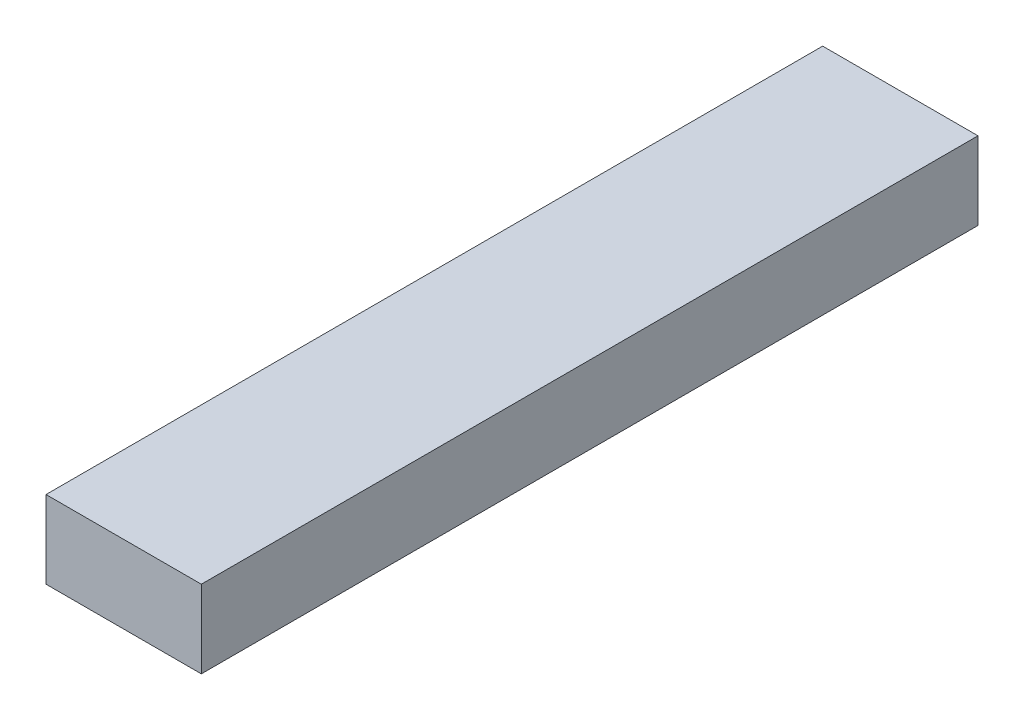
ISO-10303-21;
HEADER;
FILE_DESCRIPTION(('STEP AP214'),'2;1');
FILE_NAME('part.step','',(''),(''),'','','');
FILE_SCHEMA(('AUTOMOTIVE_DESIGN { 1 0 10303 214 1 1 1 1 }'));
ENDSEC;
DATA;
#1=APPLICATION_CONTEXT('core data for automotive mechanical design processes');
#2=APPLICATION_PROTOCOL_DEFINITION('international standard','automotive_design',2000,#1);
#3=PRODUCT_CONTEXT('',#1,'mechanical');
#4=PRODUCT('Part','Part','',(#3));
#5=PRODUCT_RELATED_PRODUCT_CATEGORY('part','',(#4));
#6=PRODUCT_DEFINITION_FORMATION('','',#4);
#7=PRODUCT_DEFINITION_CONTEXT('part definition',#1,'design');
#8=PRODUCT_DEFINITION('design','',#6,#7);
#9=PRODUCT_DEFINITION_SHAPE('','',#8);
#10=(LENGTH_UNIT() NAMED_UNIT(*) SI_UNIT(.MILLI.,.METRE.));
#11=(NAMED_UNIT(*) PLANE_ANGLE_UNIT() SI_UNIT($,.RADIAN.));
#12=(NAMED_UNIT(*) SI_UNIT($,.STERADIAN.) SOLID_ANGLE_UNIT());
#13=UNCERTAINTY_MEASURE_WITH_UNIT(LENGTH_MEASURE(1.E-05),#10,'distance_accuracy_value','');
#14=(GEOMETRIC_REPRESENTATION_CONTEXT(3) GLOBAL_UNCERTAINTY_ASSIGNED_CONTEXT((#13)) GLOBAL_UNIT_ASSIGNED_CONTEXT((#10,
#11,#12)) REPRESENTATION_CONTEXT('',''));
#15=CARTESIAN_POINT('',(0.,0.,0.));
#16=DIRECTION('',(0.,0.,1.));
#17=DIRECTION('',(1.,0.,0.));
#18=AXIS2_PLACEMENT_3D('',#15,#16,#17);
#19=CARTESIAN_POINT('',(0.,0.,200.));
#20=DIRECTION('',(1.,0.,0.));
#21=DIRECTION('',(0.,0.,-1.));
#22=AXIS2_PLACEMENT_3D('',#19,#20,#21);
#23=PLANE('',#22);
#24=DIRECTION('',(0.,-1.,0.));
#25=VECTOR('',#24,1.);
#26=CARTESIAN_POINT('',(0.,0.,0.));
#27=LINE('',#26,#25);
#28=CARTESIAN_POINT('',(0.,20.,0.));
#29=VERTEX_POINT('',#28);
#30=CARTESIAN_POINT('',(0.,0.,0.));
#31=VERTEX_POINT('',#30);
#32=EDGE_CURVE('E96',#29,#31,#27,.T.);
#33=ORIENTED_EDGE('',*,*,#32,.T.);
#34=DIRECTION('',(0.,0.,-1.));
#35=VECTOR('',#34,1.);
#36=CARTESIAN_POINT('',(0.,0.,200.));
#37=LINE('',#36,#35);
#38=CARTESIAN_POINT('',(0.,0.,200.));
#39=VERTEX_POINT('',#38);
#40=EDGE_CURVE('E11',#39,#31,#37,.T.);
#41=ORIENTED_EDGE('',*,*,#40,.F.);
#42=DIRECTION('',(0.,-1.,0.));
#43=VECTOR('',#42,1.);
#44=CARTESIAN_POINT('',(0.,0.,200.));
#45=LINE('',#44,#43);
#46=CARTESIAN_POINT('',(0.,20.,200.));
#47=VERTEX_POINT('',#46);
#48=EDGE_CURVE('E84',#47,#39,#45,.T.);
#49=ORIENTED_EDGE('',*,*,#48,.F.);
#50=DIRECTION('',(0.,0.,-1.));
#51=VECTOR('',#50,1.);
#52=CARTESIAN_POINT('',(0.,20.,200.));
#53=LINE('',#52,#51);
#54=EDGE_CURVE('E92',#47,#29,#53,.T.);
#55=ORIENTED_EDGE('',*,*,#54,.T.);
#56=EDGE_LOOP('',(#33,#41,#49,#55));
#57=FACE_BOUND('',#56,.T.);
#58=ADVANCED_FACE('F33',(#57),#23,.F.);
#59=CARTESIAN_POINT('',(0.,0.,200.));
#60=DIRECTION('',(0.,1.,0.));
#61=DIRECTION('',(0.,0.,1.));
#62=AXIS2_PLACEMENT_3D('',#59,#60,#61);
#63=PLANE('',#62);
#64=DIRECTION('',(1.,0.,0.));
#65=VECTOR('',#64,1.);
#66=CARTESIAN_POINT('',(0.,0.,0.));
#67=LINE('',#66,#65);
#68=CARTESIAN_POINT('',(40.,0.,0.));
#69=VERTEX_POINT('',#68);
#70=EDGE_CURVE('E88',#31,#69,#67,.T.);
#71=ORIENTED_EDGE('',*,*,#70,.T.);
#72=DIRECTION('',(0.,0.,-1.));
#73=VECTOR('',#72,1.);
#74=CARTESIAN_POINT('',(40.,0.,200.));
#75=LINE('',#74,#73);
#76=CARTESIAN_POINT('',(40.,0.,200.));
#77=VERTEX_POINT('',#76);
#78=EDGE_CURVE('E41',#77,#69,#75,.T.);
#79=ORIENTED_EDGE('',*,*,#78,.F.);
#80=DIRECTION('',(1.,0.,0.));
#81=VECTOR('',#80,1.);
#82=CARTESIAN_POINT('',(0.,0.,200.));
#83=LINE('',#82,#81);
#84=EDGE_CURVE('E79',#39,#77,#83,.T.);
#85=ORIENTED_EDGE('',*,*,#84,.F.);
#86=ORIENTED_EDGE('',*,*,#40,.T.);
#87=EDGE_LOOP('',(#71,#79,#85,#86));
#88=FACE_BOUND('',#87,.T.);
#89=ADVANCED_FACE('F87',(#88),#63,.F.);
#90=CARTESIAN_POINT('',(40.,0.,200.));
#91=DIRECTION('',(-1.,0.,0.));
#92=DIRECTION('',(0.,0.,1.));
#93=AXIS2_PLACEMENT_3D('',#90,#91,#92);
#94=PLANE('',#93);
#95=DIRECTION('',(0.,1.,0.));
#96=VECTOR('',#95,1.);
#97=CARTESIAN_POINT('',(40.,0.,0.));
#98=LINE('',#97,#96);
#99=CARTESIAN_POINT('',(40.,20.,0.));
#100=VERTEX_POINT('',#99);
#101=EDGE_CURVE('E66',#69,#100,#98,.T.);
#102=ORIENTED_EDGE('',*,*,#101,.T.);
#103=DIRECTION('',(0.,0.,-1.));
#104=VECTOR('',#103,1.);
#105=CARTESIAN_POINT('',(40.,20.,200.));
#106=LINE('',#105,#104);
#107=CARTESIAN_POINT('',(40.,20.,200.));
#108=VERTEX_POINT('',#107);
#109=EDGE_CURVE('E89',#108,#100,#106,.T.);
#110=ORIENTED_EDGE('',*,*,#109,.F.);
#111=DIRECTION('',(0.,1.,0.));
#112=VECTOR('',#111,1.);
#113=CARTESIAN_POINT('',(40.,0.,200.));
#114=LINE('',#113,#112);
#115=EDGE_CURVE('E82',#77,#108,#114,.T.);
#116=ORIENTED_EDGE('',*,*,#115,.F.);
#117=ORIENTED_EDGE('',*,*,#78,.T.);
#118=EDGE_LOOP('',(#102,#110,#116,#117));
#119=FACE_BOUND('',#118,.T.);
#120=ADVANCED_FACE('F90',(#119),#94,.F.);
#121=CARTESIAN_POINT('',(0.,20.,200.));
#122=DIRECTION('',(0.,-1.,0.));
#123=DIRECTION('',(0.,0.,-1.));
#124=AXIS2_PLACEMENT_3D('',#121,#122,#123);
#125=PLANE('',#124);
#126=DIRECTION('',(-1.,0.,0.));
#127=VECTOR('',#126,1.);
#128=CARTESIAN_POINT('',(0.,20.,0.));
#129=LINE('',#128,#127);
#130=EDGE_CURVE('E72',#100,#29,#129,.T.);
#131=ORIENTED_EDGE('',*,*,#130,.T.);
#132=ORIENTED_EDGE('',*,*,#54,.F.);
#133=DIRECTION('',(-1.,0.,0.));
#134=VECTOR('',#133,1.);
#135=CARTESIAN_POINT('',(0.,20.,200.));
#136=LINE('',#135,#134);
#137=EDGE_CURVE('E49',#108,#47,#136,.T.);
#138=ORIENTED_EDGE('',*,*,#137,.F.);
#139=ORIENTED_EDGE('',*,*,#109,.T.);
#140=EDGE_LOOP('',(#131,#132,#138,#139));
#141=FACE_BOUND('',#140,.T.);
#142=ADVANCED_FACE('F103',(#141),#125,.F.);
#143=CARTESIAN_POINT('',(0.,0.,200.));
#144=DIRECTION('',(0.,0.,-1.));
#145=DIRECTION('',(-1.,0.,0.));
#146=AXIS2_PLACEMENT_3D('',#143,#144,#145);
#147=PLANE('',#146);
#148=ORIENTED_EDGE('',*,*,#48,.T.);
#149=ORIENTED_EDGE('',*,*,#84,.T.);
#150=ORIENTED_EDGE('',*,*,#115,.T.);
#151=ORIENTED_EDGE('',*,*,#137,.T.);
#152=EDGE_LOOP('',(#148,#149,#150,#151));
#153=FACE_BOUND('',#152,.T.);
#154=ADVANCED_FACE('F80',(#153),#147,.F.);
#155=CARTESIAN_POINT('',(0.,0.,0.));
#156=DIRECTION('',(0.,0.,-1.));
#157=DIRECTION('',(-1.,0.,0.));
#158=AXIS2_PLACEMENT_3D('',#155,#156,#157);
#159=PLANE('',#158);
#160=ORIENTED_EDGE('',*,*,#32,.F.);
#161=ORIENTED_EDGE('',*,*,#130,.F.);
#162=ORIENTED_EDGE('',*,*,#101,.F.);
#163=ORIENTED_EDGE('',*,*,#70,.F.);
#164=EDGE_LOOP('',(#160,#161,#162,#163));
#165=FACE_BOUND('',#164,.T.);
#166=ADVANCED_FACE('F106',(#165),#159,.T.);
#167=CLOSED_SHELL('',(#58,#89,#120,#142,#154,#166));
#168=MANIFOLD_SOLID_BREP('B2',#167);
#169=ADVANCED_BREP_SHAPE_REPRESENTATION('',(#18,#168),#14);
#170=SHAPE_DEFINITION_REPRESENTATION(#9,#169);
ENDSEC;
END-ISO-10303-21;
